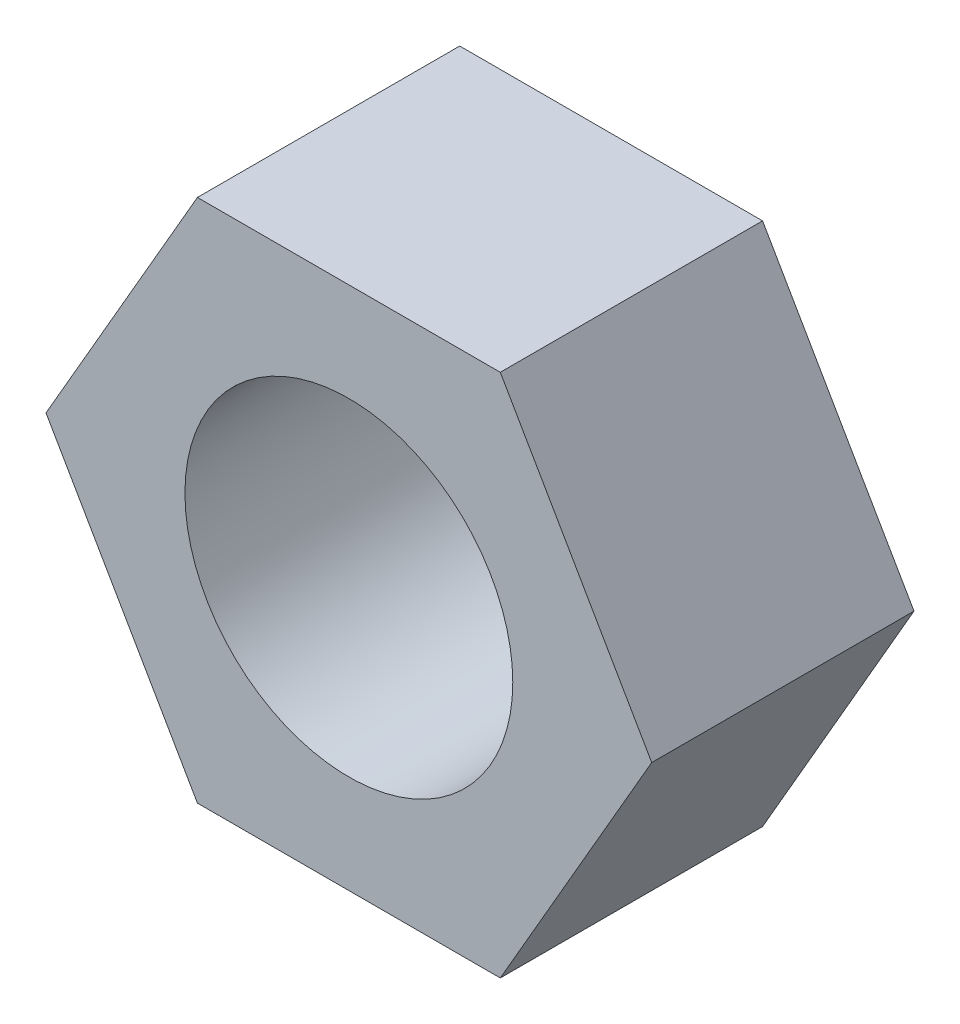
ISO-10303-21;
HEADER;
FILE_DESCRIPTION(('STEP AP214'),'2;1');
FILE_NAME('part.step','',(''),(''),'','','');
FILE_SCHEMA(('AUTOMOTIVE_DESIGN { 1 0 10303 214 1 1 1 1 }'));
ENDSEC;
DATA;
#1=APPLICATION_CONTEXT('core data for automotive mechanical design processes');
#2=APPLICATION_PROTOCOL_DEFINITION('international standard','automotive_design',2000,#1);
#3=PRODUCT_CONTEXT('',#1,'mechanical');
#4=PRODUCT('Part','Part','',(#3));
#5=PRODUCT_RELATED_PRODUCT_CATEGORY('part','',(#4));
#6=PRODUCT_DEFINITION_FORMATION('','',#4);
#7=PRODUCT_DEFINITION_CONTEXT('part definition',#1,'design');
#8=PRODUCT_DEFINITION('design','',#6,#7);
#9=PRODUCT_DEFINITION_SHAPE('','',#8);
#10=(LENGTH_UNIT() NAMED_UNIT(*) SI_UNIT(.MILLI.,.METRE.));
#11=(NAMED_UNIT(*) PLANE_ANGLE_UNIT() SI_UNIT($,.RADIAN.));
#12=(NAMED_UNIT(*) SI_UNIT($,.STERADIAN.) SOLID_ANGLE_UNIT());
#13=UNCERTAINTY_MEASURE_WITH_UNIT(LENGTH_MEASURE(1.E-05),#10,'distance_accuracy_value','');
#14=(GEOMETRIC_REPRESENTATION_CONTEXT(3) GLOBAL_UNCERTAINTY_ASSIGNED_CONTEXT((#13)) GLOBAL_UNIT_ASSIGNED_CONTEXT((#10,
#11,#12)) REPRESENTATION_CONTEXT('',''));
#15=CARTESIAN_POINT('',(0.,0.,0.));
#16=DIRECTION('',(0.,0.,1.));
#17=DIRECTION('',(1.,0.,0.));
#18=AXIS2_PLACEMENT_3D('',#15,#16,#17);
#19=CARTESIAN_POINT('',(2.3094010767585,-4.,4.));
#20=DIRECTION('',(-0.866025403784438,0.5,0.));
#21=DIRECTION('',(-0.5,-0.866025403784438,0.));
#22=AXIS2_PLACEMENT_3D('',#19,#20,#21);
#23=PLANE('',#22);
#24=DIRECTION('',(0.5,0.866025403784438,0.));
#25=VECTOR('',#24,1.);
#26=CARTESIAN_POINT('',(2.3094010767585,-4.,0.));
#27=LINE('',#26,#25);
#28=CARTESIAN_POINT('',(2.3094010767585,-4.,0.));
#29=VERTEX_POINT('',#28);
#30=CARTESIAN_POINT('',(4.61880215351701,0.,0.));
#31=VERTEX_POINT('',#30);
#32=EDGE_CURVE('E123',#29,#31,#27,.T.);
#33=ORIENTED_EDGE('',*,*,#32,.T.);
#34=DIRECTION('',(0.,0.,-1.));
#35=VECTOR('',#34,1.);
#36=CARTESIAN_POINT('',(4.61880215351701,0.,4.));
#37=LINE('',#36,#35);
#38=CARTESIAN_POINT('',(4.61880215351701,0.,4.));
#39=VERTEX_POINT('',#38);
#40=EDGE_CURVE('E11',#39,#31,#37,.T.);
#41=ORIENTED_EDGE('',*,*,#40,.F.);
#42=DIRECTION('',(0.5,0.866025403784438,0.));
#43=VECTOR('',#42,1.);
#44=CARTESIAN_POINT('',(2.3094010767585,-4.,4.));
#45=LINE('',#44,#43);
#46=CARTESIAN_POINT('',(2.3094010767585,-4.,4.));
#47=VERTEX_POINT('',#46);
#48=EDGE_CURVE('E134',#47,#39,#45,.T.);
#49=ORIENTED_EDGE('',*,*,#48,.F.);
#50=DIRECTION('',(0.,0.,-1.));
#51=VECTOR('',#50,1.);
#52=CARTESIAN_POINT('',(2.3094010767585,-4.,4.));
#53=LINE('',#52,#51);
#54=EDGE_CURVE('E119',#47,#29,#53,.T.);
#55=ORIENTED_EDGE('',*,*,#54,.T.);
#56=EDGE_LOOP('',(#33,#41,#49,#55));
#57=FACE_BOUND('',#56,.T.);
#58=ADVANCED_FACE('F39',(#57),#23,.F.);
#59=CARTESIAN_POINT('',(4.61880215351701,0.,4.));
#60=DIRECTION('',(-0.866025403784439,-0.5,0.));
#61=DIRECTION('',(0.5,-0.866025403784439,0.));
#62=AXIS2_PLACEMENT_3D('',#59,#60,#61);
#63=PLANE('',#62);
#64=DIRECTION('',(-0.5,0.866025403784439,0.));
#65=VECTOR('',#64,1.);
#66=CARTESIAN_POINT('',(4.61880215351701,0.,0.));
#67=LINE('',#66,#65);
#68=CARTESIAN_POINT('',(2.3094010767585,4.,0.));
#69=VERTEX_POINT('',#68);
#70=EDGE_CURVE('E126',#31,#69,#67,.T.);
#71=ORIENTED_EDGE('',*,*,#70,.T.);
#72=DIRECTION('',(0.,0.,-1.));
#73=VECTOR('',#72,1.);
#74=CARTESIAN_POINT('',(2.3094010767585,4.,4.));
#75=LINE('',#74,#73);
#76=CARTESIAN_POINT('',(2.3094010767585,4.,4.));
#77=VERTEX_POINT('',#76);
#78=EDGE_CURVE('E47',#77,#69,#75,.T.);
#79=ORIENTED_EDGE('',*,*,#78,.F.);
#80=DIRECTION('',(-0.5,0.866025403784439,0.));
#81=VECTOR('',#80,1.);
#82=CARTESIAN_POINT('',(4.61880215351701,0.,4.));
#83=LINE('',#82,#81);
#84=EDGE_CURVE('E92',#39,#77,#83,.T.);
#85=ORIENTED_EDGE('',*,*,#84,.F.);
#86=ORIENTED_EDGE('',*,*,#40,.T.);
#87=EDGE_LOOP('',(#71,#79,#85,#86));
#88=FACE_BOUND('',#87,.T.);
#89=ADVANCED_FACE('F159',(#88),#63,.F.);
#90=CARTESIAN_POINT('',(2.3094010767585,4.,4.));
#91=DIRECTION('',(0.,-1.,0.));
#92=DIRECTION('',(1.,0.,0.));
#93=AXIS2_PLACEMENT_3D('',#90,#91,#92);
#94=PLANE('',#93);
#95=DIRECTION('',(-1.,0.,0.));
#96=VECTOR('',#95,1.);
#97=CARTESIAN_POINT('',(2.3094010767585,4.,0.));
#98=LINE('',#97,#96);
#99=CARTESIAN_POINT('',(-2.3094010767585,4.,0.));
#100=VERTEX_POINT('',#99);
#101=EDGE_CURVE('E129',#69,#100,#98,.T.);
#102=ORIENTED_EDGE('',*,*,#101,.T.);
#103=DIRECTION('',(0.,0.,-1.));
#104=VECTOR('',#103,1.);
#105=CARTESIAN_POINT('',(-2.3094010767585,4.,4.));
#106=LINE('',#105,#104);
#107=CARTESIAN_POINT('',(-2.3094010767585,4.,4.));
#108=VERTEX_POINT('',#107);
#109=EDGE_CURVE('E114',#108,#100,#106,.T.);
#110=ORIENTED_EDGE('',*,*,#109,.F.);
#111=DIRECTION('',(-1.,0.,0.));
#112=VECTOR('',#111,1.);
#113=CARTESIAN_POINT('',(2.3094010767585,4.,4.));
#114=LINE('',#113,#112);
#115=EDGE_CURVE('E105',#77,#108,#114,.T.);
#116=ORIENTED_EDGE('',*,*,#115,.F.);
#117=ORIENTED_EDGE('',*,*,#78,.T.);
#118=EDGE_LOOP('',(#102,#110,#116,#117));
#119=FACE_BOUND('',#118,.T.);
#120=ADVANCED_FACE('F140',(#119),#94,.F.);
#121=CARTESIAN_POINT('',(-2.3094010767585,4.,4.));
#122=DIRECTION('',(0.866025403784438,-0.5,0.));
#123=DIRECTION('',(0.5,0.866025403784438,0.));
#124=AXIS2_PLACEMENT_3D('',#121,#122,#123);
#125=PLANE('',#124);
#126=DIRECTION('',(-0.5,-0.866025403784438,0.));
#127=VECTOR('',#126,1.);
#128=CARTESIAN_POINT('',(-2.3094010767585,4.,0.));
#129=LINE('',#128,#127);
#130=CARTESIAN_POINT('',(-4.61880215351701,0.,0.));
#131=VERTEX_POINT('',#130);
#132=EDGE_CURVE('E113',#100,#131,#129,.T.);
#133=ORIENTED_EDGE('',*,*,#132,.T.);
#134=DIRECTION('',(0.,0.,-1.));
#135=VECTOR('',#134,1.);
#136=CARTESIAN_POINT('',(-4.61880215351701,0.,4.));
#137=LINE('',#136,#135);
#138=CARTESIAN_POINT('',(-4.61880215351701,0.,4.));
#139=VERTEX_POINT('',#138);
#140=EDGE_CURVE('E110',#139,#131,#137,.T.);
#141=ORIENTED_EDGE('',*,*,#140,.F.);
#142=DIRECTION('',(-0.5,-0.866025403784438,0.));
#143=VECTOR('',#142,1.);
#144=CARTESIAN_POINT('',(-2.3094010767585,4.,4.));
#145=LINE('',#144,#143);
#146=EDGE_CURVE('E99',#108,#139,#145,.T.);
#147=ORIENTED_EDGE('',*,*,#146,.F.);
#148=ORIENTED_EDGE('',*,*,#109,.T.);
#149=EDGE_LOOP('',(#133,#141,#147,#148));
#150=FACE_BOUND('',#149,.T.);
#151=ADVANCED_FACE('F111',(#150),#125,.F.);
#152=CARTESIAN_POINT('',(-4.61880215351701,0.,4.));
#153=DIRECTION('',(0.866025403784439,0.5,0.));
#154=DIRECTION('',(-0.5,0.866025403784439,0.));
#155=AXIS2_PLACEMENT_3D('',#152,#153,#154);
#156=PLANE('',#155);
#157=DIRECTION('',(0.5,-0.866025403784439,0.));
#158=VECTOR('',#157,1.);
#159=CARTESIAN_POINT('',(-4.61880215351701,0.,0.));
#160=LINE('',#159,#158);
#161=CARTESIAN_POINT('',(-2.30940107675851,-4.,0.));
#162=VERTEX_POINT('',#161);
#163=EDGE_CURVE('E78',#131,#162,#160,.T.);
#164=ORIENTED_EDGE('',*,*,#163,.T.);
#165=DIRECTION('',(0.,0.,-1.));
#166=VECTOR('',#165,1.);
#167=CARTESIAN_POINT('',(-2.30940107675851,-4.,4.));
#168=LINE('',#167,#166);
#169=CARTESIAN_POINT('',(-2.30940107675851,-4.,4.));
#170=VERTEX_POINT('',#169);
#171=EDGE_CURVE('E115',#170,#162,#168,.T.);
#172=ORIENTED_EDGE('',*,*,#171,.F.);
#173=DIRECTION('',(0.5,-0.866025403784439,0.));
#174=VECTOR('',#173,1.);
#175=CARTESIAN_POINT('',(-4.61880215351701,0.,4.));
#176=LINE('',#175,#174);
#177=EDGE_CURVE('E103',#139,#170,#176,.T.);
#178=ORIENTED_EDGE('',*,*,#177,.F.);
#179=ORIENTED_EDGE('',*,*,#140,.T.);
#180=EDGE_LOOP('',(#164,#172,#178,#179));
#181=FACE_BOUND('',#180,.T.);
#182=ADVANCED_FACE('F117',(#181),#156,.F.);
#183=CARTESIAN_POINT('',(-2.30940107675851,-4.,4.));
#184=DIRECTION('',(0.,1.,0.));
#185=DIRECTION('',(-1.,0.,0.));
#186=AXIS2_PLACEMENT_3D('',#183,#184,#185);
#187=PLANE('',#186);
#188=DIRECTION('',(1.,0.,0.));
#189=VECTOR('',#188,1.);
#190=CARTESIAN_POINT('',(-2.30940107675851,-4.,0.));
#191=LINE('',#190,#189);
#192=EDGE_CURVE('E84',#162,#29,#191,.T.);
#193=ORIENTED_EDGE('',*,*,#192,.T.);
#194=ORIENTED_EDGE('',*,*,#54,.F.);
#195=DIRECTION('',(1.,0.,0.));
#196=VECTOR('',#195,1.);
#197=CARTESIAN_POINT('',(-2.30940107675851,-4.,4.));
#198=LINE('',#197,#196);
#199=EDGE_CURVE('E55',#170,#47,#198,.T.);
#200=ORIENTED_EDGE('',*,*,#199,.F.);
#201=ORIENTED_EDGE('',*,*,#171,.T.);
#202=EDGE_LOOP('',(#193,#194,#200,#201));
#203=FACE_BOUND('',#202,.T.);
#204=ADVANCED_FACE('F147',(#203),#187,.F.);
#205=CARTESIAN_POINT('',(0.,0.,4.));
#206=DIRECTION('',(0.,0.,1.));
#207=DIRECTION('',(1.,0.,0.));
#208=AXIS2_PLACEMENT_3D('',#205,#206,#207);
#209=PLANE('',#208);
#210=CARTESIAN_POINT('',(0.,0.,4.));
#211=DIRECTION('',(0.,0.,1.));
#212=DIRECTION('',(1.,0.,0.));
#213=AXIS2_PLACEMENT_3D('',#210,#211,#212);
#214=CIRCLE('',#213,2.5);
#215=CARTESIAN_POINT('',(2.5,0.,4.));
#216=VERTEX_POINT('',#215);
#217=EDGE_CURVE('E127',#216,#216,#214,.T.);
#218=ORIENTED_EDGE('',*,*,#217,.F.);
#219=EDGE_LOOP('',(#218));
#220=FACE_BOUND('',#219,.T.);
#221=ORIENTED_EDGE('',*,*,#48,.T.);
#222=ORIENTED_EDGE('',*,*,#84,.T.);
#223=ORIENTED_EDGE('',*,*,#115,.T.);
#224=ORIENTED_EDGE('',*,*,#146,.T.);
#225=ORIENTED_EDGE('',*,*,#177,.T.);
#226=ORIENTED_EDGE('',*,*,#199,.T.);
#227=EDGE_LOOP('',(#221,#222,#223,#224,#225,#226));
#228=FACE_BOUND('',#227,.T.);
#229=ADVANCED_FACE('F101',(#220,#228),#209,.T.);
#230=CARTESIAN_POINT('',(0.,0.,0.));
#231=DIRECTION('',(0.,0.,1.));
#232=DIRECTION('',(1.,0.,0.));
#233=AXIS2_PLACEMENT_3D('',#230,#231,#232);
#234=PLANE('',#233);
#235=CARTESIAN_POINT('',(0.,0.,0.));
#236=DIRECTION('',(0.,0.,1.));
#237=DIRECTION('',(1.,0.,0.));
#238=AXIS2_PLACEMENT_3D('',#235,#236,#237);
#239=CIRCLE('',#238,2.5);
#240=CARTESIAN_POINT('',(2.5,0.,0.));
#241=VERTEX_POINT('',#240);
#242=EDGE_CURVE('E215',#241,#241,#239,.T.);
#243=ORIENTED_EDGE('',*,*,#242,.T.);
#244=EDGE_LOOP('',(#243));
#245=FACE_BOUND('',#244,.T.);
#246=ORIENTED_EDGE('',*,*,#32,.F.);
#247=ORIENTED_EDGE('',*,*,#192,.F.);
#248=ORIENTED_EDGE('',*,*,#163,.F.);
#249=ORIENTED_EDGE('',*,*,#132,.F.);
#250=ORIENTED_EDGE('',*,*,#101,.F.);
#251=ORIENTED_EDGE('',*,*,#70,.F.);
#252=EDGE_LOOP('',(#246,#247,#248,#249,#250,#251));
#253=FACE_BOUND('',#252,.T.);
#254=ADVANCED_FACE('F143',(#245,#253),#234,.F.);
#255=CARTESIAN_POINT('',(0.,0.,4.));
#256=DIRECTION('',(0.,0.,-1.));
#257=DIRECTION('',(-1.,0.,0.));
#258=AXIS2_PLACEMENT_3D('',#255,#256,#257);
#259=CYLINDRICAL_SURFACE('',#258,2.5);
#260=ORIENTED_EDGE('',*,*,#217,.T.);
#261=EDGE_LOOP('',(#260));
#262=FACE_BOUND('',#261,.T.);
#263=ORIENTED_EDGE('',*,*,#242,.F.);
#264=EDGE_LOOP('',(#263));
#265=FACE_BOUND('',#264,.T.);
#266=ADVANCED_FACE('F198',(#262,#265),#259,.F.);
#267=CLOSED_SHELL('',(#58,#89,#120,#151,#182,#204,#229,#254,#266));
#268=MANIFOLD_SOLID_BREP('B2',#267);
#269=ADVANCED_BREP_SHAPE_REPRESENTATION('',(#18,#268),#14);
#270=SHAPE_DEFINITION_REPRESENTATION(#9,#269);
ENDSEC;
END-ISO-10303-21;
